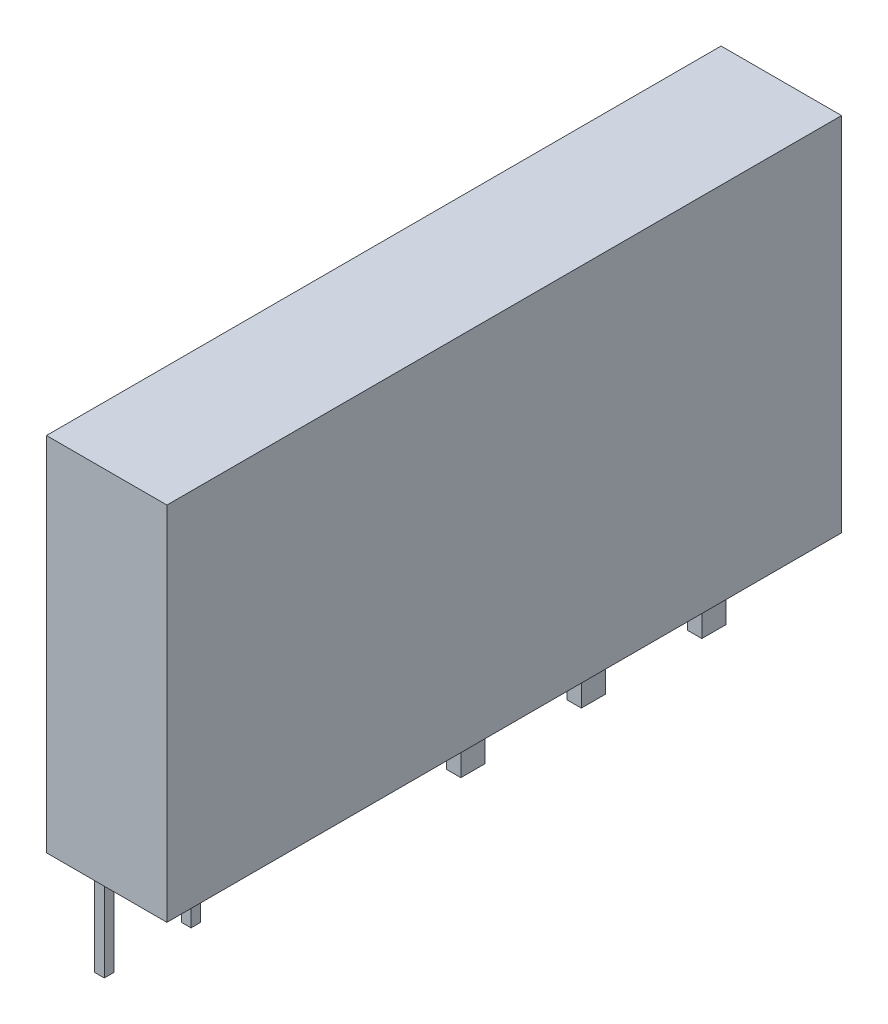
ISO-10303-21;
HEADER;
FILE_DESCRIPTION(('STEP AP214'),'2;1');
FILE_NAME('part.step','',(''),(''),'','','');
FILE_SCHEMA(('AUTOMOTIVE_DESIGN { 1 0 10303 214 1 1 1 1 }'));
ENDSEC;
DATA;
#1=APPLICATION_CONTEXT('core data for automotive mechanical design processes');
#2=APPLICATION_PROTOCOL_DEFINITION('international standard','automotive_design',2000,#1);
#3=PRODUCT_CONTEXT('',#1,'mechanical');
#4=PRODUCT('Part','Part','',(#3));
#5=PRODUCT_RELATED_PRODUCT_CATEGORY('part','',(#4));
#6=PRODUCT_DEFINITION_FORMATION('','',#4);
#7=PRODUCT_DEFINITION_CONTEXT('part definition',#1,'design');
#8=PRODUCT_DEFINITION('design','',#6,#7);
#9=PRODUCT_DEFINITION_SHAPE('','',#8);
#10=(LENGTH_UNIT() NAMED_UNIT(*) SI_UNIT(.MILLI.,.METRE.));
#11=(NAMED_UNIT(*) PLANE_ANGLE_UNIT() SI_UNIT($,.RADIAN.));
#12=(NAMED_UNIT(*) SI_UNIT($,.STERADIAN.) SOLID_ANGLE_UNIT());
#13=UNCERTAINTY_MEASURE_WITH_UNIT(LENGTH_MEASURE(1.E-05),#10,'distance_accuracy_value','');
#14=(GEOMETRIC_REPRESENTATION_CONTEXT(3) GLOBAL_UNCERTAINTY_ASSIGNED_CONTEXT((#13)) GLOBAL_UNIT_ASSIGNED_CONTEXT((#10,
#11,#12)) REPRESENTATION_CONTEXT('',''));
#15=CARTESIAN_POINT('',(0.,0.,0.));
#16=DIRECTION('',(0.,0.,1.));
#17=DIRECTION('',(1.,0.,0.));
#18=AXIS2_PLACEMENT_3D('',#15,#16,#17);
#19=CARTESIAN_POINT('',(5.,0.,0.));
#20=DIRECTION('',(0.,1.,0.));
#21=DIRECTION('',(0.,0.,1.));
#22=AXIS2_PLACEMENT_3D('',#19,#20,#21);
#23=PLANE('',#22);
#24=DIRECTION('',(0.,0.,-1.));
#25=VECTOR('',#24,1.);
#26=CARTESIAN_POINT('',(1.,0.,-21.6));
#27=LINE('',#26,#25);
#28=CARTESIAN_POINT('',(1.,0.,-20.6));
#29=VERTEX_POINT('',#28);
#30=CARTESIAN_POINT('',(1.,0.,-21.6));
#31=VERTEX_POINT('',#30);
#32=EDGE_CURVE('E214',#29,#31,#27,.T.);
#33=ORIENTED_EDGE('',*,*,#32,.F.);
#34=DIRECTION('',(-1.,0.,0.));
#35=VECTOR('',#34,1.);
#36=CARTESIAN_POINT('',(1.,0.,-20.6));
#37=LINE('',#36,#35);
#38=CARTESIAN_POINT('',(1.6,0.,-20.6));
#39=VERTEX_POINT('',#38);
#40=EDGE_CURVE('E227',#39,#29,#37,.T.);
#41=ORIENTED_EDGE('',*,*,#40,.F.);
#42=DIRECTION('',(0.,0.,1.));
#43=VECTOR('',#42,1.);
#44=CARTESIAN_POINT('',(1.6,0.,-21.6));
#45=LINE('',#44,#43);
#46=CARTESIAN_POINT('',(1.6,0.,-21.6));
#47=VERTEX_POINT('',#46);
#48=EDGE_CURVE('E236',#47,#39,#45,.T.);
#49=ORIENTED_EDGE('',*,*,#48,.F.);
#50=DIRECTION('',(1.,0.,0.));
#51=VECTOR('',#50,1.);
#52=CARTESIAN_POINT('',(1.,0.,-21.6));
#53=LINE('',#52,#51);
#54=EDGE_CURVE('E217',#31,#47,#53,.T.);
#55=ORIENTED_EDGE('',*,*,#54,.F.);
#56=EDGE_LOOP('',(#33,#41,#49,#55));
#57=FACE_BOUND('',#56,.T.);
#58=DIRECTION('',(0.,0.,-1.));
#59=VECTOR('',#58,1.);
#60=CARTESIAN_POINT('',(1.,0.,-5.));
#61=LINE('',#60,#59);
#62=CARTESIAN_POINT('',(1.,0.,-4.6));
#63=VERTEX_POINT('',#62);
#64=CARTESIAN_POINT('',(1.,0.,-5.));
#65=VERTEX_POINT('',#64);
#66=EDGE_CURVE('E285',#63,#65,#61,.T.);
#67=ORIENTED_EDGE('',*,*,#66,.F.);
#68=DIRECTION('',(-1.,0.,0.));
#69=VECTOR('',#68,1.);
#70=CARTESIAN_POINT('',(1.,0.,-4.6));
#71=LINE('',#70,#69);
#72=CARTESIAN_POINT('',(1.4,0.,-4.6));
#73=VERTEX_POINT('',#72);
#74=EDGE_CURVE('E290',#73,#63,#71,.T.);
#75=ORIENTED_EDGE('',*,*,#74,.F.);
#76=DIRECTION('',(0.,0.,1.));
#77=VECTOR('',#76,1.);
#78=CARTESIAN_POINT('',(1.4,0.,-5.));
#79=LINE('',#78,#77);
#80=CARTESIAN_POINT('',(1.4,0.,-5.));
#81=VERTEX_POINT('',#80);
#82=EDGE_CURVE('E302',#81,#73,#79,.T.);
#83=ORIENTED_EDGE('',*,*,#82,.F.);
#84=DIRECTION('',(1.,0.,0.));
#85=VECTOR('',#84,1.);
#86=CARTESIAN_POINT('',(1.,0.,-5.));
#87=LINE('',#86,#85);
#88=EDGE_CURVE('E299',#65,#81,#87,.T.);
#89=ORIENTED_EDGE('',*,*,#88,.F.);
#90=EDGE_LOOP('',(#67,#75,#83,#89));
#91=FACE_BOUND('',#90,.T.);
#92=DIRECTION('',(0.,0.,-1.));
#93=VECTOR('',#92,1.);
#94=CARTESIAN_POINT('',(0.,0.,0.));
#95=LINE('',#94,#93);
#96=CARTESIAN_POINT('',(0.,0.,0.));
#97=VERTEX_POINT('',#96);
#98=CARTESIAN_POINT('',(0.,0.,-28.));
#99=VERTEX_POINT('',#98);
#100=EDGE_CURVE('E365',#97,#99,#95,.T.);
#101=ORIENTED_EDGE('',*,*,#100,.T.);
#102=DIRECTION('',(-1.,0.,0.));
#103=VECTOR('',#102,1.);
#104=CARTESIAN_POINT('',(5.,0.,-28.));
#105=LINE('',#104,#103);
#106=CARTESIAN_POINT('',(5.,0.,-28.));
#107=VERTEX_POINT('',#106);
#108=EDGE_CURVE('E40',#107,#99,#105,.T.);
#109=ORIENTED_EDGE('',*,*,#108,.F.);
#110=DIRECTION('',(0.,0.,-1.));
#111=VECTOR('',#110,1.);
#112=CARTESIAN_POINT('',(5.,0.,0.));
#113=LINE('',#112,#111);
#114=CARTESIAN_POINT('',(5.,0.,0.));
#115=VERTEX_POINT('',#114);
#116=EDGE_CURVE('E355',#115,#107,#113,.T.);
#117=ORIENTED_EDGE('',*,*,#116,.F.);
#118=DIRECTION('',(-1.,0.,0.));
#119=VECTOR('',#118,1.);
#120=CARTESIAN_POINT('',(5.,0.,0.));
#121=LINE('',#120,#119);
#122=EDGE_CURVE('E11',#115,#97,#121,.T.);
#123=ORIENTED_EDGE('',*,*,#122,.T.);
#124=EDGE_LOOP('',(#101,#109,#117,#123));
#125=FACE_BOUND('',#124,.T.);
#126=DIRECTION('',(0.,0.,-1.));
#127=VECTOR('',#126,1.);
#128=CARTESIAN_POINT('',(1.,0.,-1.4));
#129=LINE('',#128,#127);
#130=CARTESIAN_POINT('',(1.,0.,-1.));
#131=VERTEX_POINT('',#130);
#132=CARTESIAN_POINT('',(1.,0.,-1.4));
#133=VERTEX_POINT('',#132);
#134=EDGE_CURVE('E318',#131,#133,#129,.T.);
#135=ORIENTED_EDGE('',*,*,#134,.F.);
#136=DIRECTION('',(-1.,0.,0.));
#137=VECTOR('',#136,1.);
#138=CARTESIAN_POINT('',(1.,0.,-1.));
#139=LINE('',#138,#137);
#140=CARTESIAN_POINT('',(1.4,0.,-1.));
#141=VERTEX_POINT('',#140);
#142=EDGE_CURVE('E323',#141,#131,#139,.T.);
#143=ORIENTED_EDGE('',*,*,#142,.F.);
#144=DIRECTION('',(0.,0.,1.));
#145=VECTOR('',#144,1.);
#146=CARTESIAN_POINT('',(1.4,0.,-1.4));
#147=LINE('',#146,#145);
#148=CARTESIAN_POINT('',(1.4,0.,-1.4));
#149=VERTEX_POINT('',#148);
#150=EDGE_CURVE('E335',#149,#141,#147,.T.);
#151=ORIENTED_EDGE('',*,*,#150,.F.);
#152=DIRECTION('',(1.,0.,0.));
#153=VECTOR('',#152,1.);
#154=CARTESIAN_POINT('',(1.,0.,-1.4));
#155=LINE('',#154,#153);
#156=EDGE_CURVE('E332',#133,#149,#155,.T.);
#157=ORIENTED_EDGE('',*,*,#156,.F.);
#158=EDGE_LOOP('',(#135,#143,#151,#157));
#159=FACE_BOUND('',#158,.T.);
#160=DIRECTION('',(0.,0.,-1.));
#161=VECTOR('',#160,1.);
#162=CARTESIAN_POINT('',(1.,0.,-26.6));
#163=LINE('',#162,#161);
#164=CARTESIAN_POINT('',(1.,0.,-25.6));
#165=VERTEX_POINT('',#164);
#166=CARTESIAN_POINT('',(1.,0.,-26.6));
#167=VERTEX_POINT('',#166);
#168=EDGE_CURVE('E252',#165,#167,#163,.T.);
#169=ORIENTED_EDGE('',*,*,#168,.F.);
#170=DIRECTION('',(-1.,0.,0.));
#171=VECTOR('',#170,1.);
#172=CARTESIAN_POINT('',(1.,0.,-25.6));
#173=LINE('',#172,#171);
#174=CARTESIAN_POINT('',(1.6,0.,-25.6));
#175=VERTEX_POINT('',#174);
#176=EDGE_CURVE('E257',#175,#165,#173,.T.);
#177=ORIENTED_EDGE('',*,*,#176,.F.);
#178=DIRECTION('',(0.,0.,1.));
#179=VECTOR('',#178,1.);
#180=CARTESIAN_POINT('',(1.6,0.,-26.6));
#181=LINE('',#180,#179);
#182=CARTESIAN_POINT('',(1.6,0.,-26.6));
#183=VERTEX_POINT('',#182);
#184=EDGE_CURVE('E269',#183,#175,#181,.T.);
#185=ORIENTED_EDGE('',*,*,#184,.F.);
#186=DIRECTION('',(1.,0.,0.));
#187=VECTOR('',#186,1.);
#188=CARTESIAN_POINT('',(1.,0.,-26.6));
#189=LINE('',#188,#187);
#190=EDGE_CURVE('E266',#167,#183,#189,.T.);
#191=ORIENTED_EDGE('',*,*,#190,.F.);
#192=EDGE_LOOP('',(#169,#177,#185,#191));
#193=FACE_BOUND('',#192,.T.);
#194=DIRECTION('',(0.,0.,-1.));
#195=VECTOR('',#194,1.);
#196=CARTESIAN_POINT('',(1.,0.,-16.6));
#197=LINE('',#196,#195);
#198=CARTESIAN_POINT('',(1.,0.,-15.6));
#199=VERTEX_POINT('',#198);
#200=CARTESIAN_POINT('',(1.,0.,-16.6));
#201=VERTEX_POINT('',#200);
#202=EDGE_CURVE('E213',#199,#201,#197,.T.);
#203=ORIENTED_EDGE('',*,*,#202,.F.);
#204=DIRECTION('',(-1.,0.,0.));
#205=VECTOR('',#204,1.);
#206=CARTESIAN_POINT('',(1.,0.,-15.6));
#207=LINE('',#206,#205);
#208=CARTESIAN_POINT('',(1.6,0.,-15.6));
#209=VERTEX_POINT('',#208);
#210=EDGE_CURVE('E210',#209,#199,#207,.T.);
#211=ORIENTED_EDGE('',*,*,#210,.F.);
#212=DIRECTION('',(0.,0.,1.));
#213=VECTOR('',#212,1.);
#214=CARTESIAN_POINT('',(1.6,0.,-16.6));
#215=LINE('',#214,#213);
#216=CARTESIAN_POINT('',(1.6,0.,-16.6));
#217=VERTEX_POINT('',#216);
#218=EDGE_CURVE('E52',#217,#209,#215,.T.);
#219=ORIENTED_EDGE('',*,*,#218,.F.);
#220=DIRECTION('',(1.,0.,0.));
#221=VECTOR('',#220,1.);
#222=CARTESIAN_POINT('',(1.,0.,-16.6));
#223=LINE('',#222,#221);
#224=EDGE_CURVE('E47',#201,#217,#223,.T.);
#225=ORIENTED_EDGE('',*,*,#224,.F.);
#226=EDGE_LOOP('',(#203,#211,#219,#225));
#227=FACE_BOUND('',#226,.T.);
#228=ADVANCED_FACE('F32',(#57,#91,#125,#159,#193,#227),#23,.F.);
#229=CARTESIAN_POINT('',(5.,0.,0.));
#230=DIRECTION('',(0.,0.,-1.));
#231=DIRECTION('',(-1.,0.,0.));
#232=AXIS2_PLACEMENT_3D('',#229,#230,#231);
#233=PLANE('',#232);
#234=DIRECTION('',(0.,-1.,0.));
#235=VECTOR('',#234,1.);
#236=CARTESIAN_POINT('',(0.,0.,0.));
#237=LINE('',#236,#235);
#238=CARTESIAN_POINT('',(0.,15.,0.));
#239=VERTEX_POINT('',#238);
#240=EDGE_CURVE('E351',#239,#97,#237,.T.);
#241=ORIENTED_EDGE('',*,*,#240,.T.);
#242=ORIENTED_EDGE('',*,*,#122,.F.);
#243=DIRECTION('',(0.,-1.,0.));
#244=VECTOR('',#243,1.);
#245=CARTESIAN_POINT('',(5.,0.,0.));
#246=LINE('',#245,#244);
#247=CARTESIAN_POINT('',(5.,15.,0.));
#248=VERTEX_POINT('',#247);
#249=EDGE_CURVE('E352',#248,#115,#246,.T.);
#250=ORIENTED_EDGE('',*,*,#249,.F.);
#251=DIRECTION('',(-1.,0.,0.));
#252=VECTOR('',#251,1.);
#253=CARTESIAN_POINT('',(5.,15.,0.));
#254=LINE('',#253,#252);
#255=EDGE_CURVE('E362',#248,#239,#254,.T.);
#256=ORIENTED_EDGE('',*,*,#255,.T.);
#257=EDGE_LOOP('',(#241,#242,#250,#256));
#258=FACE_BOUND('',#257,.T.);
#259=ADVANCED_FACE('F34',(#258),#233,.F.);
#260=CARTESIAN_POINT('',(5.,0.,-28.));
#261=DIRECTION('',(0.,0.,1.));
#262=DIRECTION('',(1.,0.,0.));
#263=AXIS2_PLACEMENT_3D('',#260,#261,#262);
#264=PLANE('',#263);
#265=DIRECTION('',(0.,1.,0.));
#266=VECTOR('',#265,1.);
#267=CARTESIAN_POINT('',(0.,0.,-28.));
#268=LINE('',#267,#266);
#269=CARTESIAN_POINT('',(0.,15.,-28.));
#270=VERTEX_POINT('',#269);
#271=EDGE_CURVE('E367',#99,#270,#268,.T.);
#272=ORIENTED_EDGE('',*,*,#271,.T.);
#273=DIRECTION('',(-1.,0.,0.));
#274=VECTOR('',#273,1.);
#275=CARTESIAN_POINT('',(5.,15.,-28.));
#276=LINE('',#275,#274);
#277=CARTESIAN_POINT('',(5.,15.,-28.));
#278=VERTEX_POINT('',#277);
#279=EDGE_CURVE('E372',#278,#270,#276,.T.);
#280=ORIENTED_EDGE('',*,*,#279,.F.);
#281=DIRECTION('',(0.,1.,0.));
#282=VECTOR('',#281,1.);
#283=CARTESIAN_POINT('',(5.,0.,-28.));
#284=LINE('',#283,#282);
#285=EDGE_CURVE('E358',#107,#278,#284,.T.);
#286=ORIENTED_EDGE('',*,*,#285,.F.);
#287=ORIENTED_EDGE('',*,*,#108,.T.);
#288=EDGE_LOOP('',(#272,#280,#286,#287));
#289=FACE_BOUND('',#288,.T.);
#290=ADVANCED_FACE('F379',(#289),#264,.F.);
#291=CARTESIAN_POINT('',(5.,15.,0.));
#292=DIRECTION('',(0.,-1.,0.));
#293=DIRECTION('',(0.,0.,-1.));
#294=AXIS2_PLACEMENT_3D('',#291,#292,#293);
#295=PLANE('',#294);
#296=DIRECTION('',(0.,0.,1.));
#297=VECTOR('',#296,1.);
#298=CARTESIAN_POINT('',(0.,15.,0.));
#299=LINE('',#298,#297);
#300=EDGE_CURVE('E356',#270,#239,#299,.T.);
#301=ORIENTED_EDGE('',*,*,#300,.T.);
#302=ORIENTED_EDGE('',*,*,#255,.F.);
#303=DIRECTION('',(0.,0.,1.));
#304=VECTOR('',#303,1.);
#305=CARTESIAN_POINT('',(5.,15.,0.));
#306=LINE('',#305,#304);
#307=EDGE_CURVE('E360',#278,#248,#306,.T.);
#308=ORIENTED_EDGE('',*,*,#307,.F.);
#309=ORIENTED_EDGE('',*,*,#279,.T.);
#310=EDGE_LOOP('',(#301,#302,#308,#309));
#311=FACE_BOUND('',#310,.T.);
#312=ADVANCED_FACE('F388',(#311),#295,.F.);
#313=CARTESIAN_POINT('',(5.,0.,0.));
#314=DIRECTION('',(-1.,0.,0.));
#315=DIRECTION('',(0.,0.,1.));
#316=AXIS2_PLACEMENT_3D('',#313,#314,#315);
#317=PLANE('',#316);
#318=ORIENTED_EDGE('',*,*,#249,.T.);
#319=ORIENTED_EDGE('',*,*,#116,.T.);
#320=ORIENTED_EDGE('',*,*,#285,.T.);
#321=ORIENTED_EDGE('',*,*,#307,.T.);
#322=EDGE_LOOP('',(#318,#319,#320,#321));
#323=FACE_BOUND('',#322,.T.);
#324=ADVANCED_FACE('F394',(#323),#317,.F.);
#325=CARTESIAN_POINT('',(0.,0.,0.));
#326=DIRECTION('',(-1.,0.,0.));
#327=DIRECTION('',(0.,0.,1.));
#328=AXIS2_PLACEMENT_3D('',#325,#326,#327);
#329=PLANE('',#328);
#330=ORIENTED_EDGE('',*,*,#240,.F.);
#331=ORIENTED_EDGE('',*,*,#300,.F.);
#332=ORIENTED_EDGE('',*,*,#271,.F.);
#333=ORIENTED_EDGE('',*,*,#100,.F.);
#334=EDGE_LOOP('',(#330,#331,#332,#333));
#335=FACE_BOUND('',#334,.T.);
#336=ADVANCED_FACE('F385',(#335),#329,.T.);
#337=CARTESIAN_POINT('',(1.,-4.3,-1.4));
#338=DIRECTION('',(1.,0.,0.));
#339=DIRECTION('',(0.,0.,-1.));
#340=AXIS2_PLACEMENT_3D('',#337,#338,#339);
#341=PLANE('',#340);
#342=ORIENTED_EDGE('',*,*,#134,.T.);
#343=DIRECTION('',(0.,1.,0.));
#344=VECTOR('',#343,1.);
#345=CARTESIAN_POINT('',(1.,-4.3,-1.4));
#346=LINE('',#345,#344);
#347=CARTESIAN_POINT('',(1.,-4.3,-1.4));
#348=VERTEX_POINT('',#347);
#349=EDGE_CURVE('E348',#348,#133,#346,.T.);
#350=ORIENTED_EDGE('',*,*,#349,.F.);
#351=DIRECTION('',(0.,0.,-1.));
#352=VECTOR('',#351,1.);
#353=CARTESIAN_POINT('',(1.,-4.3,-1.4));
#354=LINE('',#353,#352);
#355=CARTESIAN_POINT('',(1.,-4.3,-1.));
#356=VERTEX_POINT('',#355);
#357=EDGE_CURVE('E319',#356,#348,#354,.T.);
#358=ORIENTED_EDGE('',*,*,#357,.F.);
#359=DIRECTION('',(0.,1.,0.));
#360=VECTOR('',#359,1.);
#361=CARTESIAN_POINT('',(1.,-4.3,-1.));
#362=LINE('',#361,#360);
#363=EDGE_CURVE('E329',#356,#131,#362,.T.);
#364=ORIENTED_EDGE('',*,*,#363,.T.);
#365=EDGE_LOOP('',(#342,#350,#358,#364));
#366=FACE_BOUND('',#365,.T.);
#367=ADVANCED_FACE('F501',(#366),#341,.F.);
#368=CARTESIAN_POINT('',(1.,-4.3,-1.4));
#369=DIRECTION('',(0.,0.,1.));
#370=DIRECTION('',(1.,0.,0.));
#371=AXIS2_PLACEMENT_3D('',#368,#369,#370);
#372=PLANE('',#371);
#373=ORIENTED_EDGE('',*,*,#156,.T.);
#374=DIRECTION('',(0.,1.,0.));
#375=VECTOR('',#374,1.);
#376=CARTESIAN_POINT('',(1.4,-4.3,-1.4));
#377=LINE('',#376,#375);
#378=CARTESIAN_POINT('',(1.4,-4.3,-1.4));
#379=VERTEX_POINT('',#378);
#380=EDGE_CURVE('E345',#379,#149,#377,.T.);
#381=ORIENTED_EDGE('',*,*,#380,.F.);
#382=DIRECTION('',(1.,0.,0.));
#383=VECTOR('',#382,1.);
#384=CARTESIAN_POINT('',(1.,-4.3,-1.4));
#385=LINE('',#384,#383);
#386=EDGE_CURVE('E322',#348,#379,#385,.T.);
#387=ORIENTED_EDGE('',*,*,#386,.F.);
#388=ORIENTED_EDGE('',*,*,#349,.T.);
#389=EDGE_LOOP('',(#373,#381,#387,#388));
#390=FACE_BOUND('',#389,.T.);
#391=ADVANCED_FACE('F497',(#390),#372,.F.);
#392=CARTESIAN_POINT('',(1.4,-4.3,-1.4));
#393=DIRECTION('',(-1.,0.,0.));
#394=DIRECTION('',(0.,0.,1.));
#395=AXIS2_PLACEMENT_3D('',#392,#393,#394);
#396=PLANE('',#395);
#397=ORIENTED_EDGE('',*,*,#150,.T.);
#398=DIRECTION('',(0.,1.,0.));
#399=VECTOR('',#398,1.);
#400=CARTESIAN_POINT('',(1.4,-4.3,-1.));
#401=LINE('',#400,#399);
#402=CARTESIAN_POINT('',(1.4,-4.3,-1.));
#403=VERTEX_POINT('',#402);
#404=EDGE_CURVE('E342',#403,#141,#401,.T.);
#405=ORIENTED_EDGE('',*,*,#404,.F.);
#406=DIRECTION('',(0.,0.,1.));
#407=VECTOR('',#406,1.);
#408=CARTESIAN_POINT('',(1.4,-4.3,-1.4));
#409=LINE('',#408,#407);
#410=EDGE_CURVE('E325',#379,#403,#409,.T.);
#411=ORIENTED_EDGE('',*,*,#410,.F.);
#412=ORIENTED_EDGE('',*,*,#380,.T.);
#413=EDGE_LOOP('',(#397,#405,#411,#412));
#414=FACE_BOUND('',#413,.T.);
#415=ADVANCED_FACE('F493',(#414),#396,.F.);
#416=CARTESIAN_POINT('',(1.,-4.3,-1.));
#417=DIRECTION('',(0.,0.,-1.));
#418=DIRECTION('',(-1.,0.,0.));
#419=AXIS2_PLACEMENT_3D('',#416,#417,#418);
#420=PLANE('',#419);
#421=ORIENTED_EDGE('',*,*,#142,.T.);
#422=ORIENTED_EDGE('',*,*,#363,.F.);
#423=DIRECTION('',(-1.,0.,0.));
#424=VECTOR('',#423,1.);
#425=CARTESIAN_POINT('',(1.,-4.3,-1.));
#426=LINE('',#425,#424);
#427=EDGE_CURVE('E327',#403,#356,#426,.T.);
#428=ORIENTED_EDGE('',*,*,#427,.F.);
#429=ORIENTED_EDGE('',*,*,#404,.T.);
#430=EDGE_LOOP('',(#421,#422,#428,#429));
#431=FACE_BOUND('',#430,.T.);
#432=ADVANCED_FACE('F489',(#431),#420,.F.);
#433=CARTESIAN_POINT('',(0.,-4.3,0.));
#434=DIRECTION('',(0.,1.,0.));
#435=DIRECTION('',(0.,0.,1.));
#436=AXIS2_PLACEMENT_3D('',#433,#434,#435);
#437=PLANE('',#436);
#438=ORIENTED_EDGE('',*,*,#357,.T.);
#439=ORIENTED_EDGE('',*,*,#386,.T.);
#440=ORIENTED_EDGE('',*,*,#410,.T.);
#441=ORIENTED_EDGE('',*,*,#427,.T.);
#442=EDGE_LOOP('',(#438,#439,#440,#441));
#443=FACE_BOUND('',#442,.T.);
#444=ADVANCED_FACE('F485',(#443),#437,.F.);
#445=CARTESIAN_POINT('',(1.,-4.3,-5.));
#446=DIRECTION('',(1.,0.,0.));
#447=DIRECTION('',(0.,0.,-1.));
#448=AXIS2_PLACEMENT_3D('',#445,#446,#447);
#449=PLANE('',#448);
#450=ORIENTED_EDGE('',*,*,#66,.T.);
#451=DIRECTION('',(0.,1.,0.));
#452=VECTOR('',#451,1.);
#453=CARTESIAN_POINT('',(1.,-4.3,-5.));
#454=LINE('',#453,#452);
#455=CARTESIAN_POINT('',(1.,-4.3,-5.));
#456=VERTEX_POINT('',#455);
#457=EDGE_CURVE('E315',#456,#65,#454,.T.);
#458=ORIENTED_EDGE('',*,*,#457,.F.);
#459=DIRECTION('',(0.,0.,-1.));
#460=VECTOR('',#459,1.);
#461=CARTESIAN_POINT('',(1.,-4.3,-5.));
#462=LINE('',#461,#460);
#463=CARTESIAN_POINT('',(1.,-4.3,-4.6));
#464=VERTEX_POINT('',#463);
#465=EDGE_CURVE('E286',#464,#456,#462,.T.);
#466=ORIENTED_EDGE('',*,*,#465,.F.);
#467=DIRECTION('',(0.,1.,0.));
#468=VECTOR('',#467,1.);
#469=CARTESIAN_POINT('',(1.,-4.3,-4.6));
#470=LINE('',#469,#468);
#471=EDGE_CURVE('E296',#464,#63,#470,.T.);
#472=ORIENTED_EDGE('',*,*,#471,.T.);
#473=EDGE_LOOP('',(#450,#458,#466,#472));
#474=FACE_BOUND('',#473,.T.);
#475=ADVANCED_FACE('F481',(#474),#449,.F.);
#476=CARTESIAN_POINT('',(1.,-4.3,-5.));
#477=DIRECTION('',(0.,0.,1.));
#478=DIRECTION('',(1.,0.,0.));
#479=AXIS2_PLACEMENT_3D('',#476,#477,#478);
#480=PLANE('',#479);
#481=ORIENTED_EDGE('',*,*,#88,.T.);
#482=DIRECTION('',(0.,1.,0.));
#483=VECTOR('',#482,1.);
#484=CARTESIAN_POINT('',(1.4,-4.3,-5.));
#485=LINE('',#484,#483);
#486=CARTESIAN_POINT('',(1.4,-4.3,-5.));
#487=VERTEX_POINT('',#486);
#488=EDGE_CURVE('E312',#487,#81,#485,.T.);
#489=ORIENTED_EDGE('',*,*,#488,.F.);
#490=DIRECTION('',(1.,0.,0.));
#491=VECTOR('',#490,1.);
#492=CARTESIAN_POINT('',(1.,-4.3,-5.));
#493=LINE('',#492,#491);
#494=EDGE_CURVE('E289',#456,#487,#493,.T.);
#495=ORIENTED_EDGE('',*,*,#494,.F.);
#496=ORIENTED_EDGE('',*,*,#457,.T.);
#497=EDGE_LOOP('',(#481,#489,#495,#496));
#498=FACE_BOUND('',#497,.T.);
#499=ADVANCED_FACE('F477',(#498),#480,.F.);
#500=CARTESIAN_POINT('',(1.4,-4.3,-5.));
#501=DIRECTION('',(-1.,0.,0.));
#502=DIRECTION('',(0.,0.,1.));
#503=AXIS2_PLACEMENT_3D('',#500,#501,#502);
#504=PLANE('',#503);
#505=ORIENTED_EDGE('',*,*,#82,.T.);
#506=DIRECTION('',(0.,1.,0.));
#507=VECTOR('',#506,1.);
#508=CARTESIAN_POINT('',(1.4,-4.3,-4.6));
#509=LINE('',#508,#507);
#510=CARTESIAN_POINT('',(1.4,-4.3,-4.6));
#511=VERTEX_POINT('',#510);
#512=EDGE_CURVE('E309',#511,#73,#509,.T.);
#513=ORIENTED_EDGE('',*,*,#512,.F.);
#514=DIRECTION('',(0.,0.,1.));
#515=VECTOR('',#514,1.);
#516=CARTESIAN_POINT('',(1.4,-4.3,-5.));
#517=LINE('',#516,#515);
#518=EDGE_CURVE('E292',#487,#511,#517,.T.);
#519=ORIENTED_EDGE('',*,*,#518,.F.);
#520=ORIENTED_EDGE('',*,*,#488,.T.);
#521=EDGE_LOOP('',(#505,#513,#519,#520));
#522=FACE_BOUND('',#521,.T.);
#523=ADVANCED_FACE('F473',(#522),#504,.F.);
#524=CARTESIAN_POINT('',(1.,-4.3,-4.6));
#525=DIRECTION('',(0.,0.,-1.));
#526=DIRECTION('',(-1.,0.,0.));
#527=AXIS2_PLACEMENT_3D('',#524,#525,#526);
#528=PLANE('',#527);
#529=ORIENTED_EDGE('',*,*,#74,.T.);
#530=ORIENTED_EDGE('',*,*,#471,.F.);
#531=DIRECTION('',(-1.,0.,0.));
#532=VECTOR('',#531,1.);
#533=CARTESIAN_POINT('',(1.,-4.3,-4.6));
#534=LINE('',#533,#532);
#535=EDGE_CURVE('E294',#511,#464,#534,.T.);
#536=ORIENTED_EDGE('',*,*,#535,.F.);
#537=ORIENTED_EDGE('',*,*,#512,.T.);
#538=EDGE_LOOP('',(#529,#530,#536,#537));
#539=FACE_BOUND('',#538,.T.);
#540=ADVANCED_FACE('F469',(#539),#528,.F.);
#541=CARTESIAN_POINT('',(0.,-4.3,0.));
#542=DIRECTION('',(0.,1.,0.));
#543=DIRECTION('',(0.,0.,1.));
#544=AXIS2_PLACEMENT_3D('',#541,#542,#543);
#545=PLANE('',#544);
#546=ORIENTED_EDGE('',*,*,#465,.T.);
#547=ORIENTED_EDGE('',*,*,#494,.T.);
#548=ORIENTED_EDGE('',*,*,#518,.T.);
#549=ORIENTED_EDGE('',*,*,#535,.T.);
#550=EDGE_LOOP('',(#546,#547,#548,#549));
#551=FACE_BOUND('',#550,.T.);
#552=ADVANCED_FACE('F465',(#551),#545,.F.);
#553=CARTESIAN_POINT('',(1.,-4.3,-26.6));
#554=DIRECTION('',(1.,0.,0.));
#555=DIRECTION('',(0.,0.,-1.));
#556=AXIS2_PLACEMENT_3D('',#553,#554,#555);
#557=PLANE('',#556);
#558=ORIENTED_EDGE('',*,*,#168,.T.);
#559=DIRECTION('',(0.,1.,0.));
#560=VECTOR('',#559,1.);
#561=CARTESIAN_POINT('',(1.,-4.3,-26.6));
#562=LINE('',#561,#560);
#563=CARTESIAN_POINT('',(1.,-4.3,-26.6));
#564=VERTEX_POINT('',#563);
#565=EDGE_CURVE('E282',#564,#167,#562,.T.);
#566=ORIENTED_EDGE('',*,*,#565,.F.);
#567=DIRECTION('',(0.,0.,-1.));
#568=VECTOR('',#567,1.);
#569=CARTESIAN_POINT('',(1.,-4.3,-26.6));
#570=LINE('',#569,#568);
#571=CARTESIAN_POINT('',(1.,-4.3,-25.6));
#572=VERTEX_POINT('',#571);
#573=EDGE_CURVE('E253',#572,#564,#570,.T.);
#574=ORIENTED_EDGE('',*,*,#573,.F.);
#575=DIRECTION('',(0.,1.,0.));
#576=VECTOR('',#575,1.);
#577=CARTESIAN_POINT('',(1.,-4.3,-25.6));
#578=LINE('',#577,#576);
#579=EDGE_CURVE('E263',#572,#165,#578,.T.);
#580=ORIENTED_EDGE('',*,*,#579,.T.);
#581=EDGE_LOOP('',(#558,#566,#574,#580));
#582=FACE_BOUND('',#581,.T.);
#583=ADVANCED_FACE('F461',(#582),#557,.F.);
#584=CARTESIAN_POINT('',(1.,-4.3,-26.6));
#585=DIRECTION('',(0.,0.,1.));
#586=DIRECTION('',(1.,0.,0.));
#587=AXIS2_PLACEMENT_3D('',#584,#585,#586);
#588=PLANE('',#587);
#589=ORIENTED_EDGE('',*,*,#190,.T.);
#590=DIRECTION('',(0.,1.,0.));
#591=VECTOR('',#590,1.);
#592=CARTESIAN_POINT('',(1.6,-4.3,-26.6));
#593=LINE('',#592,#591);
#594=CARTESIAN_POINT('',(1.6,-4.3,-26.6));
#595=VERTEX_POINT('',#594);
#596=EDGE_CURVE('E279',#595,#183,#593,.T.);
#597=ORIENTED_EDGE('',*,*,#596,.F.);
#598=DIRECTION('',(1.,0.,0.));
#599=VECTOR('',#598,1.);
#600=CARTESIAN_POINT('',(1.,-4.3,-26.6));
#601=LINE('',#600,#599);
#602=EDGE_CURVE('E256',#564,#595,#601,.T.);
#603=ORIENTED_EDGE('',*,*,#602,.F.);
#604=ORIENTED_EDGE('',*,*,#565,.T.);
#605=EDGE_LOOP('',(#589,#597,#603,#604));
#606=FACE_BOUND('',#605,.T.);
#607=ADVANCED_FACE('F457',(#606),#588,.F.);
#608=CARTESIAN_POINT('',(1.6,-4.3,-26.6));
#609=DIRECTION('',(-1.,0.,0.));
#610=DIRECTION('',(0.,0.,1.));
#611=AXIS2_PLACEMENT_3D('',#608,#609,#610);
#612=PLANE('',#611);
#613=ORIENTED_EDGE('',*,*,#184,.T.);
#614=DIRECTION('',(0.,1.,0.));
#615=VECTOR('',#614,1.);
#616=CARTESIAN_POINT('',(1.6,-4.3,-25.6));
#617=LINE('',#616,#615);
#618=CARTESIAN_POINT('',(1.6,-4.3,-25.6));
#619=VERTEX_POINT('',#618);
#620=EDGE_CURVE('E276',#619,#175,#617,.T.);
#621=ORIENTED_EDGE('',*,*,#620,.F.);
#622=DIRECTION('',(0.,0.,1.));
#623=VECTOR('',#622,1.);
#624=CARTESIAN_POINT('',(1.6,-4.3,-26.6));
#625=LINE('',#624,#623);
#626=EDGE_CURVE('E259',#595,#619,#625,.T.);
#627=ORIENTED_EDGE('',*,*,#626,.F.);
#628=ORIENTED_EDGE('',*,*,#596,.T.);
#629=EDGE_LOOP('',(#613,#621,#627,#628));
#630=FACE_BOUND('',#629,.T.);
#631=ADVANCED_FACE('F453',(#630),#612,.F.);
#632=CARTESIAN_POINT('',(1.,-4.3,-25.6));
#633=DIRECTION('',(0.,0.,-1.));
#634=DIRECTION('',(-1.,0.,0.));
#635=AXIS2_PLACEMENT_3D('',#632,#633,#634);
#636=PLANE('',#635);
#637=ORIENTED_EDGE('',*,*,#176,.T.);
#638=ORIENTED_EDGE('',*,*,#579,.F.);
#639=DIRECTION('',(-1.,0.,0.));
#640=VECTOR('',#639,1.);
#641=CARTESIAN_POINT('',(1.,-4.3,-25.6));
#642=LINE('',#641,#640);
#643=EDGE_CURVE('E261',#619,#572,#642,.T.);
#644=ORIENTED_EDGE('',*,*,#643,.F.);
#645=ORIENTED_EDGE('',*,*,#620,.T.);
#646=EDGE_LOOP('',(#637,#638,#644,#645));
#647=FACE_BOUND('',#646,.T.);
#648=ADVANCED_FACE('F449',(#647),#636,.F.);
#649=CARTESIAN_POINT('',(0.,-4.3,0.));
#650=DIRECTION('',(0.,1.,0.));
#651=DIRECTION('',(0.,0.,1.));
#652=AXIS2_PLACEMENT_3D('',#649,#650,#651);
#653=PLANE('',#652);
#654=ORIENTED_EDGE('',*,*,#573,.T.);
#655=ORIENTED_EDGE('',*,*,#602,.T.);
#656=ORIENTED_EDGE('',*,*,#626,.T.);
#657=ORIENTED_EDGE('',*,*,#643,.T.);
#658=EDGE_LOOP('',(#654,#655,#656,#657));
#659=FACE_BOUND('',#658,.T.);
#660=ADVANCED_FACE('F445',(#659),#653,.F.);
#661=CARTESIAN_POINT('',(1.,-4.3,-21.6));
#662=DIRECTION('',(1.,0.,0.));
#663=DIRECTION('',(0.,0.,-1.));
#664=AXIS2_PLACEMENT_3D('',#661,#662,#663);
#665=PLANE('',#664);
#666=ORIENTED_EDGE('',*,*,#32,.T.);
#667=DIRECTION('',(0.,1.,0.));
#668=VECTOR('',#667,1.);
#669=CARTESIAN_POINT('',(1.,-4.3,-21.6));
#670=LINE('',#669,#668);
#671=CARTESIAN_POINT('',(1.,-4.3,-21.6));
#672=VERTEX_POINT('',#671);
#673=EDGE_CURVE('E249',#672,#31,#670,.T.);
#674=ORIENTED_EDGE('',*,*,#673,.F.);
#675=DIRECTION('',(0.,0.,-1.));
#676=VECTOR('',#675,1.);
#677=CARTESIAN_POINT('',(1.,-4.3,-21.6));
#678=LINE('',#677,#676);
#679=CARTESIAN_POINT('',(1.,-4.3,-20.6));
#680=VERTEX_POINT('',#679);
#681=EDGE_CURVE('E223',#680,#672,#678,.T.);
#682=ORIENTED_EDGE('',*,*,#681,.F.);
#683=DIRECTION('',(0.,1.,0.));
#684=VECTOR('',#683,1.);
#685=CARTESIAN_POINT('',(1.,-4.3,-20.6));
#686=LINE('',#685,#684);
#687=EDGE_CURVE('E232',#680,#29,#686,.T.);
#688=ORIENTED_EDGE('',*,*,#687,.T.);
#689=EDGE_LOOP('',(#666,#674,#682,#688));
#690=FACE_BOUND('',#689,.T.);
#691=ADVANCED_FACE('F441',(#690),#665,.F.);
#692=CARTESIAN_POINT('',(1.,-4.3,-21.6));
#693=DIRECTION('',(0.,0.,1.));
#694=DIRECTION('',(1.,0.,0.));
#695=AXIS2_PLACEMENT_3D('',#692,#693,#694);
#696=PLANE('',#695);
#697=ORIENTED_EDGE('',*,*,#54,.T.);
#698=DIRECTION('',(0.,1.,0.));
#699=VECTOR('',#698,1.);
#700=CARTESIAN_POINT('',(1.6,-4.3,-21.6));
#701=LINE('',#700,#699);
#702=CARTESIAN_POINT('',(1.6,-4.3,-21.6));
#703=VERTEX_POINT('',#702);
#704=EDGE_CURVE('E246',#703,#47,#701,.T.);
#705=ORIENTED_EDGE('',*,*,#704,.F.);
#706=DIRECTION('',(1.,0.,0.));
#707=VECTOR('',#706,1.);
#708=CARTESIAN_POINT('',(1.,-4.3,-21.6));
#709=LINE('',#708,#707);
#710=EDGE_CURVE('E226',#672,#703,#709,.T.);
#711=ORIENTED_EDGE('',*,*,#710,.F.);
#712=ORIENTED_EDGE('',*,*,#673,.T.);
#713=EDGE_LOOP('',(#697,#705,#711,#712));
#714=FACE_BOUND('',#713,.T.);
#715=ADVANCED_FACE('F437',(#714),#696,.F.);
#716=CARTESIAN_POINT('',(1.6,-4.3,-21.6));
#717=DIRECTION('',(-1.,0.,0.));
#718=DIRECTION('',(0.,0.,1.));
#719=AXIS2_PLACEMENT_3D('',#716,#717,#718);
#720=PLANE('',#719);
#721=ORIENTED_EDGE('',*,*,#48,.T.);
#722=DIRECTION('',(0.,1.,0.));
#723=VECTOR('',#722,1.);
#724=CARTESIAN_POINT('',(1.6,-4.3,-20.6));
#725=LINE('',#724,#723);
#726=CARTESIAN_POINT('',(1.6,-4.3,-20.6));
#727=VERTEX_POINT('',#726);
#728=EDGE_CURVE('E243',#727,#39,#725,.T.);
#729=ORIENTED_EDGE('',*,*,#728,.F.);
#730=DIRECTION('',(0.,0.,1.));
#731=VECTOR('',#730,1.);
#732=CARTESIAN_POINT('',(1.6,-4.3,-21.6));
#733=LINE('',#732,#731);
#734=EDGE_CURVE('E229',#703,#727,#733,.T.);
#735=ORIENTED_EDGE('',*,*,#734,.F.);
#736=ORIENTED_EDGE('',*,*,#704,.T.);
#737=EDGE_LOOP('',(#721,#729,#735,#736));
#738=FACE_BOUND('',#737,.T.);
#739=ADVANCED_FACE('F433',(#738),#720,.F.);
#740=CARTESIAN_POINT('',(1.,-4.3,-20.6));
#741=DIRECTION('',(0.,0.,-1.));
#742=DIRECTION('',(-1.,0.,0.));
#743=AXIS2_PLACEMENT_3D('',#740,#741,#742);
#744=PLANE('',#743);
#745=ORIENTED_EDGE('',*,*,#40,.T.);
#746=ORIENTED_EDGE('',*,*,#687,.F.);
#747=DIRECTION('',(-1.,0.,0.));
#748=VECTOR('',#747,1.);
#749=CARTESIAN_POINT('',(1.,-4.3,-20.6));
#750=LINE('',#749,#748);
#751=EDGE_CURVE('E231',#727,#680,#750,.T.);
#752=ORIENTED_EDGE('',*,*,#751,.F.);
#753=ORIENTED_EDGE('',*,*,#728,.T.);
#754=EDGE_LOOP('',(#745,#746,#752,#753));
#755=FACE_BOUND('',#754,.T.);
#756=ADVANCED_FACE('F429',(#755),#744,.F.);
#757=CARTESIAN_POINT('',(0.,-4.3,0.));
#758=DIRECTION('',(0.,1.,0.));
#759=DIRECTION('',(0.,0.,1.));
#760=AXIS2_PLACEMENT_3D('',#757,#758,#759);
#761=PLANE('',#760);
#762=ORIENTED_EDGE('',*,*,#681,.T.);
#763=ORIENTED_EDGE('',*,*,#710,.T.);
#764=ORIENTED_EDGE('',*,*,#734,.T.);
#765=ORIENTED_EDGE('',*,*,#751,.T.);
#766=EDGE_LOOP('',(#762,#763,#764,#765));
#767=FACE_BOUND('',#766,.T.);
#768=ADVANCED_FACE('F426',(#767),#761,.F.);
#769=CARTESIAN_POINT('',(1.,-4.3,-16.6));
#770=DIRECTION('',(1.,0.,0.));
#771=DIRECTION('',(0.,0.,-1.));
#772=AXIS2_PLACEMENT_3D('',#769,#770,#771);
#773=PLANE('',#772);
#774=ORIENTED_EDGE('',*,*,#202,.T.);
#775=DIRECTION('',(0.,1.,0.));
#776=VECTOR('',#775,1.);
#777=CARTESIAN_POINT('',(1.,-4.3,-16.6));
#778=LINE('',#777,#776);
#779=CARTESIAN_POINT('',(1.,-4.3,-16.6));
#780=VERTEX_POINT('',#779);
#781=EDGE_CURVE('E194',#780,#201,#778,.T.);
#782=ORIENTED_EDGE('',*,*,#781,.F.);
#783=DIRECTION('',(0.,0.,-1.));
#784=VECTOR('',#783,1.);
#785=CARTESIAN_POINT('',(1.,-4.3,-16.6));
#786=LINE('',#785,#784);
#787=CARTESIAN_POINT('',(1.,-4.3,-15.6));
#788=VERTEX_POINT('',#787);
#789=EDGE_CURVE('E201',#788,#780,#786,.T.);
#790=ORIENTED_EDGE('',*,*,#789,.F.);
#791=DIRECTION('',(0.,1.,0.));
#792=VECTOR('',#791,1.);
#793=CARTESIAN_POINT('',(1.,-4.3,-15.6));
#794=LINE('',#793,#792);
#795=EDGE_CURVE('E404',#788,#199,#794,.T.);
#796=ORIENTED_EDGE('',*,*,#795,.T.);
#797=EDGE_LOOP('',(#774,#782,#790,#796));
#798=FACE_BOUND('',#797,.T.);
#799=ADVANCED_FACE('F212',(#798),#773,.F.);
#800=CARTESIAN_POINT('',(1.,-4.3,-16.6));
#801=DIRECTION('',(0.,0.,1.));
#802=DIRECTION('',(1.,0.,0.));
#803=AXIS2_PLACEMENT_3D('',#800,#801,#802);
#804=PLANE('',#803);
#805=ORIENTED_EDGE('',*,*,#224,.T.);
#806=DIRECTION('',(0.,1.,0.));
#807=VECTOR('',#806,1.);
#808=CARTESIAN_POINT('',(1.6,-4.3,-16.6));
#809=LINE('',#808,#807);
#810=CARTESIAN_POINT('',(1.6,-4.3,-16.6));
#811=VERTEX_POINT('',#810);
#812=EDGE_CURVE('E197',#811,#217,#809,.T.);
#813=ORIENTED_EDGE('',*,*,#812,.F.);
#814=DIRECTION('',(1.,0.,0.));
#815=VECTOR('',#814,1.);
#816=CARTESIAN_POINT('',(1.,-4.3,-16.6));
#817=LINE('',#816,#815);
#818=EDGE_CURVE('E190',#780,#811,#817,.T.);
#819=ORIENTED_EDGE('',*,*,#818,.F.);
#820=ORIENTED_EDGE('',*,*,#781,.T.);
#821=EDGE_LOOP('',(#805,#813,#819,#820));
#822=FACE_BOUND('',#821,.T.);
#823=ADVANCED_FACE('F192',(#822),#804,.F.);
#824=CARTESIAN_POINT('',(1.6,-4.3,-16.6));
#825=DIRECTION('',(-1.,0.,0.));
#826=DIRECTION('',(0.,0.,1.));
#827=AXIS2_PLACEMENT_3D('',#824,#825,#826);
#828=PLANE('',#827);
#829=ORIENTED_EDGE('',*,*,#218,.T.);
#830=DIRECTION('',(0.,1.,0.));
#831=VECTOR('',#830,1.);
#832=CARTESIAN_POINT('',(1.6,-4.3,-15.6));
#833=LINE('',#832,#831);
#834=CARTESIAN_POINT('',(1.6,-4.3,-15.6));
#835=VERTEX_POINT('',#834);
#836=EDGE_CURVE('E219',#835,#209,#833,.T.);
#837=ORIENTED_EDGE('',*,*,#836,.F.);
#838=DIRECTION('',(0.,0.,1.));
#839=VECTOR('',#838,1.);
#840=CARTESIAN_POINT('',(1.6,-4.3,-16.6));
#841=LINE('',#840,#839);
#842=EDGE_CURVE('E200',#811,#835,#841,.T.);
#843=ORIENTED_EDGE('',*,*,#842,.F.);
#844=ORIENTED_EDGE('',*,*,#812,.T.);
#845=EDGE_LOOP('',(#829,#837,#843,#844));
#846=FACE_BOUND('',#845,.T.);
#847=ADVANCED_FACE('F413',(#846),#828,.F.);
#848=CARTESIAN_POINT('',(1.,-4.3,-15.6));
#849=DIRECTION('',(0.,0.,-1.));
#850=DIRECTION('',(-1.,0.,0.));
#851=AXIS2_PLACEMENT_3D('',#848,#849,#850);
#852=PLANE('',#851);
#853=ORIENTED_EDGE('',*,*,#210,.T.);
#854=ORIENTED_EDGE('',*,*,#795,.F.);
#855=DIRECTION('',(-1.,0.,0.));
#856=VECTOR('',#855,1.);
#857=CARTESIAN_POINT('',(1.,-4.3,-15.6));
#858=LINE('',#857,#856);
#859=EDGE_CURVE('E206',#835,#788,#858,.T.);
#860=ORIENTED_EDGE('',*,*,#859,.F.);
#861=ORIENTED_EDGE('',*,*,#836,.T.);
#862=EDGE_LOOP('',(#853,#854,#860,#861));
#863=FACE_BOUND('',#862,.T.);
#864=ADVANCED_FACE('F403',(#863),#852,.F.);
#865=CARTESIAN_POINT('',(0.,-4.3,0.));
#866=DIRECTION('',(0.,1.,0.));
#867=DIRECTION('',(0.,0.,1.));
#868=AXIS2_PLACEMENT_3D('',#865,#866,#867);
#869=PLANE('',#868);
#870=ORIENTED_EDGE('',*,*,#789,.T.);
#871=ORIENTED_EDGE('',*,*,#818,.T.);
#872=ORIENTED_EDGE('',*,*,#842,.T.);
#873=ORIENTED_EDGE('',*,*,#859,.T.);
#874=EDGE_LOOP('',(#870,#871,#872,#873));
#875=FACE_BOUND('',#874,.T.);
#876=ADVANCED_FACE('F204',(#875),#869,.F.);
#877=CLOSED_SHELL('',(#228,#259,#290,#312,#324,#336,#367,#391,#415,#432,#444,#475,#499,#523,
#540,#552,#583,#607,#631,#648,#660,#691,#715,#739,#756,#768,#799,#823,#847,#864,#876));
#878=MANIFOLD_SOLID_BREP('B2',#877);
#879=ADVANCED_BREP_SHAPE_REPRESENTATION('',(#18,#878),#14);
#880=SHAPE_DEFINITION_REPRESENTATION(#9,#879);
ENDSEC;
END-ISO-10303-21;
